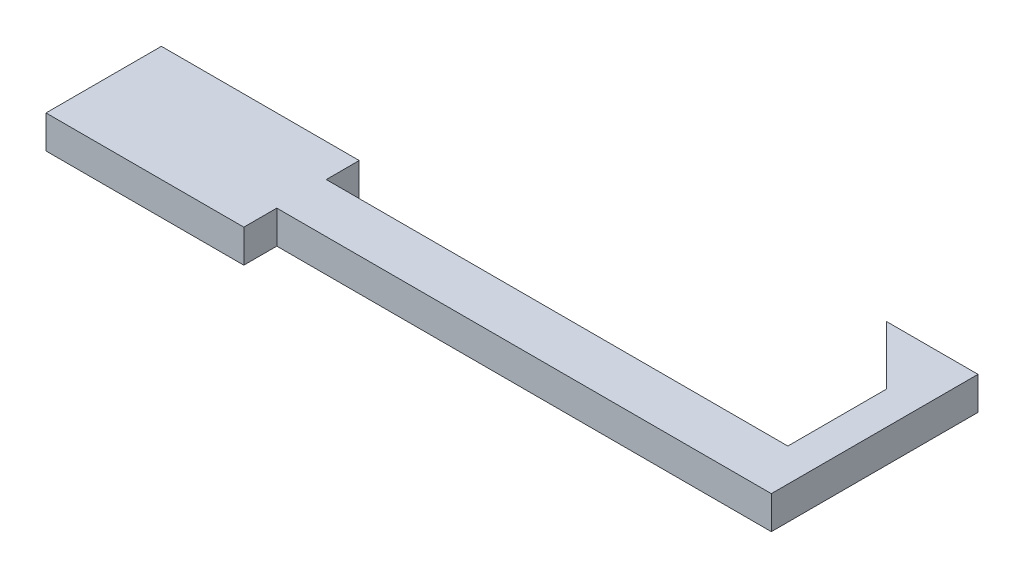
ISO-10303-21;
HEADER;
FILE_DESCRIPTION(('STEP AP214'),'2;1');
FILE_NAME('part.step','',(''),(''),'','','');
FILE_SCHEMA(('AUTOMOTIVE_DESIGN { 1 0 10303 214 1 1 1 1 }'));
ENDSEC;
DATA;
#1=APPLICATION_CONTEXT('core data for automotive mechanical design processes');
#2=APPLICATION_PROTOCOL_DEFINITION('international standard','automotive_design',2000,#1);
#3=PRODUCT_CONTEXT('',#1,'mechanical');
#4=PRODUCT('Part','Part','',(#3));
#5=PRODUCT_RELATED_PRODUCT_CATEGORY('part','',(#4));
#6=PRODUCT_DEFINITION_FORMATION('','',#4);
#7=PRODUCT_DEFINITION_CONTEXT('part definition',#1,'design');
#8=PRODUCT_DEFINITION('design','',#6,#7);
#9=PRODUCT_DEFINITION_SHAPE('','',#8);
#10=(LENGTH_UNIT() NAMED_UNIT(*) SI_UNIT(.MILLI.,.METRE.));
#11=(NAMED_UNIT(*) PLANE_ANGLE_UNIT() SI_UNIT($,.RADIAN.));
#12=(NAMED_UNIT(*) SI_UNIT($,.STERADIAN.) SOLID_ANGLE_UNIT());
#13=UNCERTAINTY_MEASURE_WITH_UNIT(LENGTH_MEASURE(1.E-05),#10,'distance_accuracy_value','');
#14=(GEOMETRIC_REPRESENTATION_CONTEXT(3) GLOBAL_UNCERTAINTY_ASSIGNED_CONTEXT((#13)) GLOBAL_UNIT_ASSIGNED_CONTEXT((#10,
#11,#12)) REPRESENTATION_CONTEXT('',''));
#15=CARTESIAN_POINT('',(0.,0.,0.));
#16=DIRECTION('',(0.,0.,1.));
#17=DIRECTION('',(1.,0.,0.));
#18=AXIS2_PLACEMENT_3D('',#15,#16,#17);
#19=CARTESIAN_POINT('',(-30.9732967707679,0.5,0.));
#20=DIRECTION('',(-1.,0.,0.));
#21=DIRECTION('',(0.,0.,1.));
#22=AXIS2_PLACEMENT_3D('',#19,#20,#21);
#23=PLANE('',#22);
#24=DIRECTION('',(0.,0.,-1.));
#25=VECTOR('',#24,1.);
#26=CARTESIAN_POINT('',(-30.9732967707679,0.,0.));
#27=LINE('',#26,#25);
#28=CARTESIAN_POINT('',(-30.9732967707679,0.,-20.9421827779806));
#29=VERTEX_POINT('',#28);
#30=CARTESIAN_POINT('',(-30.9732967707679,0.,-22.6921827779806));
#31=VERTEX_POINT('',#30);
#32=EDGE_CURVE('E214',#29,#31,#27,.T.);
#33=ORIENTED_EDGE('',*,*,#32,.F.);
#34=DIRECTION('',(0.,-1.,0.));
#35=VECTOR('',#34,1.);
#36=CARTESIAN_POINT('',(-30.9732967707679,0.5,-20.9421827779806));
#37=LINE('',#36,#35);
#38=CARTESIAN_POINT('',(-30.9732967707679,0.5,-20.9421827779806));
#39=VERTEX_POINT('',#38);
#40=EDGE_CURVE('E11',#39,#29,#37,.T.);
#41=ORIENTED_EDGE('',*,*,#40,.F.);
#42=DIRECTION('',(0.,0.,-1.));
#43=VECTOR('',#42,1.);
#44=CARTESIAN_POINT('',(-30.9732967707679,0.5,0.));
#45=LINE('',#44,#43);
#46=CARTESIAN_POINT('',(-30.9732967707679,0.5,-22.6921827779806));
#47=VERTEX_POINT('',#46);
#48=EDGE_CURVE('E168',#39,#47,#45,.T.);
#49=ORIENTED_EDGE('',*,*,#48,.T.);
#50=DIRECTION('',(0.,-1.,0.));
#51=VECTOR('',#50,1.);
#52=CARTESIAN_POINT('',(-30.9732967707679,0.5,-22.6921827779806));
#53=LINE('',#52,#51);
#54=EDGE_CURVE('E101',#47,#31,#53,.T.);
#55=ORIENTED_EDGE('',*,*,#54,.T.);
#56=EDGE_LOOP('',(#33,#41,#49,#55));
#57=FACE_BOUND('',#56,.T.);
#58=ADVANCED_FACE('F41',(#57),#23,.T.);
#59=CARTESIAN_POINT('',(0.,0.5,-20.9421827779806));
#60=DIRECTION('',(0.,0.,1.));
#61=DIRECTION('',(1.,0.,0.));
#62=AXIS2_PLACEMENT_3D('',#59,#60,#61);
#63=PLANE('',#62);
#64=DIRECTION('',(-1.,0.,0.));
#65=VECTOR('',#64,1.);
#66=CARTESIAN_POINT('',(0.,0.,-20.9421827779806));
#67=LINE('',#66,#65);
#68=CARTESIAN_POINT('',(-27.9732967707679,0.,-20.9421827779806));
#69=VERTEX_POINT('',#68);
#70=EDGE_CURVE('E210',#69,#29,#67,.T.);
#71=ORIENTED_EDGE('',*,*,#70,.F.);
#72=DIRECTION('',(0.,-1.,0.));
#73=VECTOR('',#72,1.);
#74=CARTESIAN_POINT('',(-27.9732967707679,0.5,-20.9421827779806));
#75=LINE('',#74,#73);
#76=CARTESIAN_POINT('',(-27.9732967707679,0.5,-20.9421827779806));
#77=VERTEX_POINT('',#76);
#78=EDGE_CURVE('E50',#77,#69,#75,.T.);
#79=ORIENTED_EDGE('',*,*,#78,.F.);
#80=DIRECTION('',(-1.,0.,0.));
#81=VECTOR('',#80,1.);
#82=CARTESIAN_POINT('',(0.,0.5,-20.9421827779806));
#83=LINE('',#82,#81);
#84=EDGE_CURVE('E161',#77,#39,#83,.T.);
#85=ORIENTED_EDGE('',*,*,#84,.T.);
#86=ORIENTED_EDGE('',*,*,#40,.T.);
#87=EDGE_LOOP('',(#71,#79,#85,#86));
#88=FACE_BOUND('',#87,.T.);
#89=ADVANCED_FACE('F211',(#88),#63,.T.);
#90=CARTESIAN_POINT('',(-27.9732967707679,0.5,0.));
#91=DIRECTION('',(1.,0.,0.));
#92=DIRECTION('',(0.,0.,-1.));
#93=AXIS2_PLACEMENT_3D('',#90,#91,#92);
#94=PLANE('',#93);
#95=DIRECTION('',(0.,0.,1.));
#96=VECTOR('',#95,1.);
#97=CARTESIAN_POINT('',(-27.9732967707679,0.,0.));
#98=LINE('',#97,#96);
#99=CARTESIAN_POINT('',(-27.9732967707679,0.,-21.4421827779806));
#100=VERTEX_POINT('',#99);
#101=EDGE_CURVE('E180',#100,#69,#98,.T.);
#102=ORIENTED_EDGE('',*,*,#101,.F.);
#103=DIRECTION('',(0.,-1.,0.));
#104=VECTOR('',#103,1.);
#105=CARTESIAN_POINT('',(-27.9732967707679,0.5,-21.4421827779806));
#106=LINE('',#105,#104);
#107=CARTESIAN_POINT('',(-27.9732967707679,0.5,-21.4421827779806));
#108=VERTEX_POINT('',#107);
#109=EDGE_CURVE('E202',#108,#100,#106,.T.);
#110=ORIENTED_EDGE('',*,*,#109,.F.);
#111=DIRECTION('',(0.,0.,1.));
#112=VECTOR('',#111,1.);
#113=CARTESIAN_POINT('',(-27.9732967707679,0.5,0.));
#114=LINE('',#113,#112);
#115=EDGE_CURVE('E153',#108,#77,#114,.T.);
#116=ORIENTED_EDGE('',*,*,#115,.T.);
#117=ORIENTED_EDGE('',*,*,#78,.T.);
#118=EDGE_LOOP('',(#102,#110,#116,#117));
#119=FACE_BOUND('',#118,.T.);
#120=ADVANCED_FACE('F207',(#119),#94,.T.);
#121=CARTESIAN_POINT('',(0.,0.5,-21.4421827779806));
#122=DIRECTION('',(0.,0.,-1.));
#123=DIRECTION('',(-1.,0.,0.));
#124=AXIS2_PLACEMENT_3D('',#121,#122,#123);
#125=PLANE('',#124);
#126=DIRECTION('',(1.,0.,0.));
#127=VECTOR('',#126,1.);
#128=CARTESIAN_POINT('',(0.,0.,-21.4421827779806));
#129=LINE('',#128,#127);
#130=CARTESIAN_POINT('',(-20.4732967707679,0.,-21.4421827779806));
#131=VERTEX_POINT('',#130);
#132=EDGE_CURVE('E220',#100,#131,#129,.T.);
#133=ORIENTED_EDGE('',*,*,#132,.T.);
#134=DIRECTION('',(0.,-1.,0.));
#135=VECTOR('',#134,1.);
#136=CARTESIAN_POINT('',(-20.4732967707679,0.5,-21.4421827779806));
#137=LINE('',#136,#135);
#138=CARTESIAN_POINT('',(-20.4732967707679,0.5,-21.4421827779806));
#139=VERTEX_POINT('',#138);
#140=EDGE_CURVE('E199',#139,#131,#137,.T.);
#141=ORIENTED_EDGE('',*,*,#140,.F.);
#142=DIRECTION('',(1.,0.,0.));
#143=VECTOR('',#142,1.);
#144=CARTESIAN_POINT('',(0.,0.5,-21.4421827779806));
#145=LINE('',#144,#143);
#146=EDGE_CURVE('E160',#108,#139,#145,.T.);
#147=ORIENTED_EDGE('',*,*,#146,.F.);
#148=ORIENTED_EDGE('',*,*,#109,.T.);
#149=EDGE_LOOP('',(#133,#141,#147,#148));
#150=FACE_BOUND('',#149,.T.);
#151=ADVANCED_FACE('F285',(#150),#125,.F.);
#152=CARTESIAN_POINT('',(-20.4732967707679,0.5,0.));
#153=DIRECTION('',(1.,0.,0.));
#154=DIRECTION('',(0.,0.,-1.));
#155=AXIS2_PLACEMENT_3D('',#152,#153,#154);
#156=PLANE('',#155);
#157=DIRECTION('',(0.,0.,1.));
#158=VECTOR('',#157,1.);
#159=CARTESIAN_POINT('',(-20.4732967707679,0.,0.));
#160=LINE('',#159,#158);
#161=CARTESIAN_POINT('',(-20.4732967707679,0.,-24.5760662544638));
#162=VERTEX_POINT('',#161);
#163=EDGE_CURVE('E223',#162,#131,#160,.T.);
#164=ORIENTED_EDGE('',*,*,#163,.F.);
#165=DIRECTION('',(0.,-1.,0.));
#166=VECTOR('',#165,1.);
#167=CARTESIAN_POINT('',(-20.4732967707679,0.5,-24.5760662544638));
#168=LINE('',#167,#166);
#169=CARTESIAN_POINT('',(-20.4732967707679,0.5,-24.5760662544638));
#170=VERTEX_POINT('',#169);
#171=EDGE_CURVE('E196',#170,#162,#168,.T.);
#172=ORIENTED_EDGE('',*,*,#171,.F.);
#173=DIRECTION('',(0.,0.,1.));
#174=VECTOR('',#173,1.);
#175=CARTESIAN_POINT('',(-20.4732967707679,0.5,0.));
#176=LINE('',#175,#174);
#177=EDGE_CURVE('E166',#170,#139,#176,.T.);
#178=ORIENTED_EDGE('',*,*,#177,.T.);
#179=ORIENTED_EDGE('',*,*,#140,.T.);
#180=EDGE_LOOP('',(#164,#172,#178,#179));
#181=FACE_BOUND('',#180,.T.);
#182=ADVANCED_FACE('F258',(#181),#156,.T.);
#183=CARTESIAN_POINT('',(0.,0.5,-24.5760662544638));
#184=DIRECTION('',(0.,0.,-1.));
#185=DIRECTION('',(-1.,0.,0.));
#186=AXIS2_PLACEMENT_3D('',#183,#184,#185);
#187=PLANE('',#186);
#188=DIRECTION('',(1.,0.,0.));
#189=VECTOR('',#188,1.);
#190=CARTESIAN_POINT('',(0.,0.,-24.5760662544638));
#191=LINE('',#190,#189);
#192=CARTESIAN_POINT('',(-21.8571802472511,0.,-24.5760662544638));
#193=VERTEX_POINT('',#192);
#194=EDGE_CURVE('E229',#193,#162,#191,.T.);
#195=ORIENTED_EDGE('',*,*,#194,.F.);
#196=DIRECTION('',(0.,-1.,0.));
#197=VECTOR('',#196,1.);
#198=CARTESIAN_POINT('',(-21.8571802472511,0.5,-24.5760662544638));
#199=LINE('',#198,#197);
#200=CARTESIAN_POINT('',(-21.8571802472511,0.5,-24.5760662544638));
#201=VERTEX_POINT('',#200);
#202=EDGE_CURVE('E193',#201,#193,#199,.T.);
#203=ORIENTED_EDGE('',*,*,#202,.F.);
#204=DIRECTION('',(1.,0.,0.));
#205=VECTOR('',#204,1.);
#206=CARTESIAN_POINT('',(0.,0.5,-24.5760662544638));
#207=LINE('',#206,#205);
#208=EDGE_CURVE('E249',#201,#170,#207,.T.);
#209=ORIENTED_EDGE('',*,*,#208,.T.);
#210=ORIENTED_EDGE('',*,*,#171,.T.);
#211=EDGE_LOOP('',(#195,#203,#209,#210));
#212=FACE_BOUND('',#211,.T.);
#213=ADVANCED_FACE('F264',(#212),#187,.T.);
#214=CARTESIAN_POINT('',(1.35944300360635,0.5,-1.35944300360635));
#215=DIRECTION('',(-0.707106781186547,0.,0.707106781186547));
#216=DIRECTION('',(0.707106781186548,0.,0.707106781186548));
#217=AXIS2_PLACEMENT_3D('',#214,#215,#216);
#218=PLANE('',#217);
#219=DIRECTION('',(-0.707106781186548,0.,-0.707106781186548));
#220=VECTOR('',#219,1.);
#221=CARTESIAN_POINT('',(1.35944300360635,0.,-1.35944300360635));
#222=LINE('',#221,#220);
#223=CARTESIAN_POINT('',(-20.9732967707679,0.,-23.6921827779806));
#224=VERTEX_POINT('',#223);
#225=EDGE_CURVE('E233',#224,#193,#222,.T.);
#226=ORIENTED_EDGE('',*,*,#225,.F.);
#227=DIRECTION('',(0.,-1.,0.));
#228=VECTOR('',#227,1.);
#229=CARTESIAN_POINT('',(-20.9732967707679,0.5,-23.6921827779806));
#230=LINE('',#229,#228);
#231=CARTESIAN_POINT('',(-20.9732967707679,0.5,-23.6921827779806));
#232=VERTEX_POINT('',#231);
#233=EDGE_CURVE('E190',#232,#224,#230,.T.);
#234=ORIENTED_EDGE('',*,*,#233,.F.);
#235=DIRECTION('',(-0.707106781186548,0.,-0.707106781186548));
#236=VECTOR('',#235,1.);
#237=CARTESIAN_POINT('',(1.35944300360635,0.5,-1.35944300360635));
#238=LINE('',#237,#236);
#239=EDGE_CURVE('E245',#232,#201,#238,.T.);
#240=ORIENTED_EDGE('',*,*,#239,.T.);
#241=ORIENTED_EDGE('',*,*,#202,.T.);
#242=EDGE_LOOP('',(#226,#234,#240,#241));
#243=FACE_BOUND('',#242,.T.);
#244=ADVANCED_FACE('F267',(#243),#218,.T.);
#245=CARTESIAN_POINT('',(-20.9732967707679,0.5,0.));
#246=DIRECTION('',(-1.,0.,0.));
#247=DIRECTION('',(0.,0.,1.));
#248=AXIS2_PLACEMENT_3D('',#245,#246,#247);
#249=PLANE('',#248);
#250=DIRECTION('',(0.,0.,-1.));
#251=VECTOR('',#250,1.);
#252=CARTESIAN_POINT('',(-20.9732967707679,0.,0.));
#253=LINE('',#252,#251);
#254=CARTESIAN_POINT('',(-20.9732967707679,0.,-22.1921827779806));
#255=VERTEX_POINT('',#254);
#256=EDGE_CURVE('E236',#255,#224,#253,.T.);
#257=ORIENTED_EDGE('',*,*,#256,.F.);
#258=DIRECTION('',(0.,-1.,0.));
#259=VECTOR('',#258,1.);
#260=CARTESIAN_POINT('',(-20.9732967707679,0.5,-22.1921827779806));
#261=LINE('',#260,#259);
#262=CARTESIAN_POINT('',(-20.9732967707679,0.5,-22.1921827779806));
#263=VERTEX_POINT('',#262);
#264=EDGE_CURVE('E140',#263,#255,#261,.T.);
#265=ORIENTED_EDGE('',*,*,#264,.F.);
#266=DIRECTION('',(0.,0.,-1.));
#267=VECTOR('',#266,1.);
#268=CARTESIAN_POINT('',(-20.9732967707679,0.5,0.));
#269=LINE('',#268,#267);
#270=EDGE_CURVE('E147',#263,#232,#269,.T.);
#271=ORIENTED_EDGE('',*,*,#270,.T.);
#272=ORIENTED_EDGE('',*,*,#233,.T.);
#273=EDGE_LOOP('',(#257,#265,#271,#272));
#274=FACE_BOUND('',#273,.T.);
#275=ADVANCED_FACE('F269',(#274),#249,.T.);
#276=CARTESIAN_POINT('',(0.,0.5,-22.1921827779806));
#277=DIRECTION('',(0.,0.,-1.));
#278=DIRECTION('',(-1.,0.,0.));
#279=AXIS2_PLACEMENT_3D('',#276,#277,#278);
#280=PLANE('',#279);
#281=DIRECTION('',(1.,0.,0.));
#282=VECTOR('',#281,1.);
#283=CARTESIAN_POINT('',(0.,0.,-22.1921827779806));
#284=LINE('',#283,#282);
#285=CARTESIAN_POINT('',(-27.9732967707679,0.,-22.1921827779806));
#286=VERTEX_POINT('',#285);
#287=EDGE_CURVE('E134',#286,#255,#284,.T.);
#288=ORIENTED_EDGE('',*,*,#287,.F.);
#289=DIRECTION('',(0.,-1.,0.));
#290=VECTOR('',#289,1.);
#291=CARTESIAN_POINT('',(-27.9732967707679,0.5,-22.1921827779806));
#292=LINE('',#291,#290);
#293=CARTESIAN_POINT('',(-27.9732967707679,0.5,-22.1921827779806));
#294=VERTEX_POINT('',#293);
#295=EDGE_CURVE('E129',#294,#286,#292,.T.);
#296=ORIENTED_EDGE('',*,*,#295,.F.);
#297=DIRECTION('',(1.,0.,0.));
#298=VECTOR('',#297,1.);
#299=CARTESIAN_POINT('',(0.,0.5,-22.1921827779806));
#300=LINE('',#299,#298);
#301=EDGE_CURVE('E132',#294,#263,#300,.T.);
#302=ORIENTED_EDGE('',*,*,#301,.T.);
#303=ORIENTED_EDGE('',*,*,#264,.T.);
#304=EDGE_LOOP('',(#288,#296,#302,#303));
#305=FACE_BOUND('',#304,.T.);
#306=ADVANCED_FACE('F131',(#305),#280,.T.);
#307=CARTESIAN_POINT('',(-27.9732967707679,0.,-22.6921827779806));
#308=VERTEX_POINT('',#307);
#309=EDGE_CURVE('E175',#308,#286,#98,.T.);
#310=ORIENTED_EDGE('',*,*,#309,.F.);
#311=DIRECTION('',(0.,-1.,0.));
#312=VECTOR('',#311,1.);
#313=CARTESIAN_POINT('',(-27.9732967707679,0.5,-22.6921827779806));
#314=LINE('',#313,#312);
#315=CARTESIAN_POINT('',(-27.9732967707679,0.5,-22.6921827779806));
#316=VERTEX_POINT('',#315);
#317=EDGE_CURVE('E94',#316,#308,#314,.T.);
#318=ORIENTED_EDGE('',*,*,#317,.F.);
#319=EDGE_CURVE('E144',#316,#294,#114,.T.);
#320=ORIENTED_EDGE('',*,*,#319,.T.);
#321=ORIENTED_EDGE('',*,*,#295,.T.);
#322=EDGE_LOOP('',(#310,#318,#320,#321));
#323=FACE_BOUND('',#322,.T.);
#324=ADVANCED_FACE('F150',(#323),#94,.T.);
#325=CARTESIAN_POINT('',(0.,0.5,-22.6921827779806));
#326=DIRECTION('',(0.,0.,1.));
#327=DIRECTION('',(1.,0.,0.));
#328=AXIS2_PLACEMENT_3D('',#325,#326,#327);
#329=PLANE('',#328);
#330=DIRECTION('',(-1.,0.,0.));
#331=VECTOR('',#330,1.);
#332=CARTESIAN_POINT('',(0.,0.,-22.6921827779806));
#333=LINE('',#332,#331);
#334=EDGE_CURVE('E172',#308,#31,#333,.T.);
#335=ORIENTED_EDGE('',*,*,#334,.T.);
#336=ORIENTED_EDGE('',*,*,#54,.F.);
#337=DIRECTION('',(-1.,0.,0.));
#338=VECTOR('',#337,1.);
#339=CARTESIAN_POINT('',(0.,0.5,-22.6921827779806));
#340=LINE('',#339,#338);
#341=EDGE_CURVE('E58',#316,#47,#340,.T.);
#342=ORIENTED_EDGE('',*,*,#341,.F.);
#343=ORIENTED_EDGE('',*,*,#317,.T.);
#344=EDGE_LOOP('',(#335,#336,#342,#343));
#345=FACE_BOUND('',#344,.T.);
#346=ADVANCED_FACE('F322',(#345),#329,.F.);
#347=CARTESIAN_POINT('',(0.,0.5,0.));
#348=DIRECTION('',(0.,1.,0.));
#349=DIRECTION('',(0.,0.,1.));
#350=AXIS2_PLACEMENT_3D('',#347,#348,#349);
#351=PLANE('',#350);
#352=ORIENTED_EDGE('',*,*,#48,.F.);
#353=ORIENTED_EDGE('',*,*,#84,.F.);
#354=ORIENTED_EDGE('',*,*,#115,.F.);
#355=ORIENTED_EDGE('',*,*,#146,.T.);
#356=ORIENTED_EDGE('',*,*,#177,.F.);
#357=ORIENTED_EDGE('',*,*,#208,.F.);
#358=ORIENTED_EDGE('',*,*,#239,.F.);
#359=ORIENTED_EDGE('',*,*,#270,.F.);
#360=ORIENTED_EDGE('',*,*,#301,.F.);
#361=ORIENTED_EDGE('',*,*,#319,.F.);
#362=ORIENTED_EDGE('',*,*,#341,.T.);
#363=EDGE_LOOP('',(#352,#353,#354,#355,#356,#357,#358,#359,#360,#361,#362));
#364=FACE_BOUND('',#363,.T.);
#365=ADVANCED_FACE('F143',(#364),#351,.T.);
#366=CARTESIAN_POINT('',(0.,0.,0.));
#367=DIRECTION('',(0.,1.,0.));
#368=DIRECTION('',(0.,0.,1.));
#369=AXIS2_PLACEMENT_3D('',#366,#367,#368);
#370=PLANE('',#369);
#371=ORIENTED_EDGE('',*,*,#32,.T.);
#372=ORIENTED_EDGE('',*,*,#334,.F.);
#373=ORIENTED_EDGE('',*,*,#309,.T.);
#374=ORIENTED_EDGE('',*,*,#287,.T.);
#375=ORIENTED_EDGE('',*,*,#256,.T.);
#376=ORIENTED_EDGE('',*,*,#225,.T.);
#377=ORIENTED_EDGE('',*,*,#194,.T.);
#378=ORIENTED_EDGE('',*,*,#163,.T.);
#379=ORIENTED_EDGE('',*,*,#132,.F.);
#380=ORIENTED_EDGE('',*,*,#101,.T.);
#381=ORIENTED_EDGE('',*,*,#70,.T.);
#382=EDGE_LOOP('',(#371,#372,#373,#374,#375,#376,#377,#378,#379,#380,#381));
#383=FACE_BOUND('',#382,.T.);
#384=ADVANCED_FACE('F217',(#383),#370,.F.);
#385=CLOSED_SHELL('',(#58,#89,#120,#151,#182,#213,#244,#275,#306,#324,#346,#365,#384));
#386=MANIFOLD_SOLID_BREP('B2',#385);
#387=ADVANCED_BREP_SHAPE_REPRESENTATION('',(#18,#386),#14);
#388=SHAPE_DEFINITION_REPRESENTATION(#9,#387);
ENDSEC;
END-ISO-10303-21;
